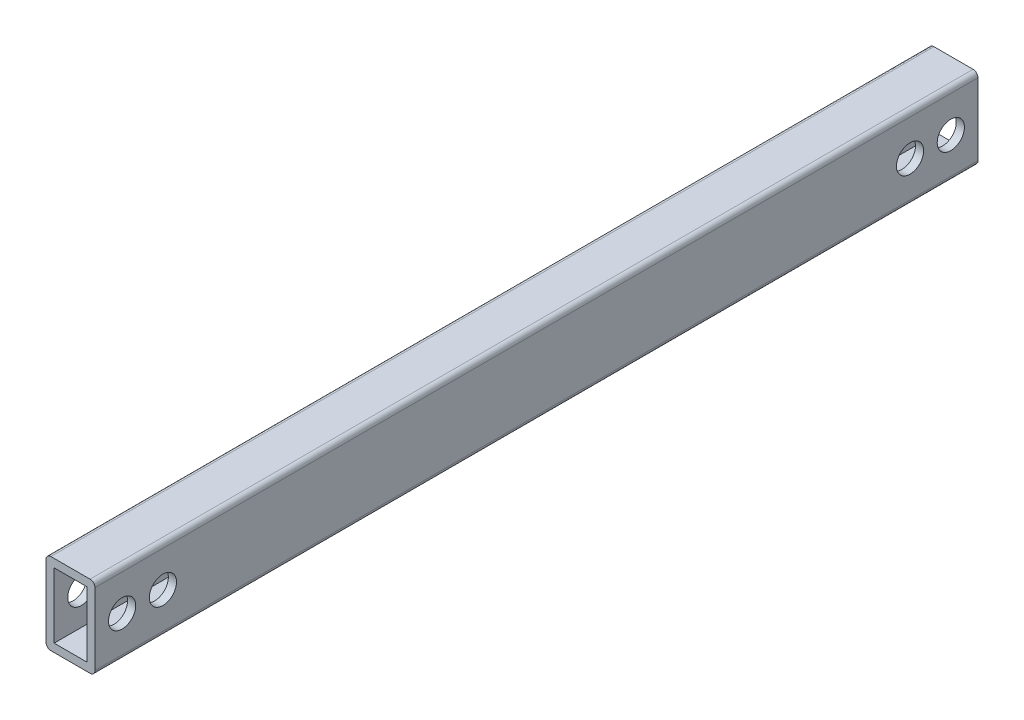
ISO-10303-21;
HEADER;
FILE_DESCRIPTION(('STEP AP214'),'2;1');
FILE_NAME('part.step','',(''),(''),'','','');
FILE_SCHEMA(('AUTOMOTIVE_DESIGN { 1 0 10303 214 1 1 1 1 }'));
ENDSEC;
DATA;
#1=APPLICATION_CONTEXT('core data for automotive mechanical design processes');
#2=APPLICATION_PROTOCOL_DEFINITION('international standard','automotive_design',2000,#1);
#3=PRODUCT_CONTEXT('',#1,'mechanical');
#4=PRODUCT('Part','Part','',(#3));
#5=PRODUCT_RELATED_PRODUCT_CATEGORY('part','',(#4));
#6=PRODUCT_DEFINITION_FORMATION('','',#4);
#7=PRODUCT_DEFINITION_CONTEXT('part definition',#1,'design');
#8=PRODUCT_DEFINITION('design','',#6,#7);
#9=PRODUCT_DEFINITION_SHAPE('','',#8);
#10=(LENGTH_UNIT() NAMED_UNIT(*) SI_UNIT(.MILLI.,.METRE.));
#11=(NAMED_UNIT(*) PLANE_ANGLE_UNIT() SI_UNIT($,.RADIAN.));
#12=(NAMED_UNIT(*) SI_UNIT($,.STERADIAN.) SOLID_ANGLE_UNIT());
#13=UNCERTAINTY_MEASURE_WITH_UNIT(LENGTH_MEASURE(1.E-05),#10,'distance_accuracy_value','');
#14=(GEOMETRIC_REPRESENTATION_CONTEXT(3) GLOBAL_UNCERTAINTY_ASSIGNED_CONTEXT((#13)) GLOBAL_UNIT_ASSIGNED_CONTEXT((#10,
#11,#12)) REPRESENTATION_CONTEXT('',''));
#15=CARTESIAN_POINT('',(0.,0.,0.));
#16=DIRECTION('',(0.,0.,1.));
#17=DIRECTION('',(1.,0.,0.));
#18=AXIS2_PLACEMENT_3D('',#15,#16,#17);
#19=CARTESIAN_POINT('',(0.,0.,324.79860434));
#20=DIRECTION('',(0.,0.,1.));
#21=DIRECTION('',(1.,0.,0.));
#22=AXIS2_PLACEMENT_3D('',#19,#20,#21);
#23=PLANE('',#22);
#24=DIRECTION('',(0.,-1.,0.));
#25=VECTOR('',#24,1.);
#26=CARTESIAN_POINT('',(-9.,-15.,324.79860434));
#27=LINE('',#26,#25);
#28=CARTESIAN_POINT('',(-9.,13.2,324.79860434));
#29=VERTEX_POINT('',#28);
#30=CARTESIAN_POINT('',(-9.,-13.2,324.79860434));
#31=VERTEX_POINT('',#30);
#32=EDGE_CURVE('E170',#29,#31,#27,.T.);
#33=ORIENTED_EDGE('',*,*,#32,.T.);
#34=CARTESIAN_POINT('',(-7.2,-13.2,324.79860434));
#35=DIRECTION('',(0.,0.,1.));
#36=DIRECTION('',(1.,0.,0.));
#37=AXIS2_PLACEMENT_3D('',#34,#35,#36);
#38=CIRCLE('',#37,1.8);
#39=CARTESIAN_POINT('',(-7.2,-15.,324.79860434));
#40=VERTEX_POINT('',#39);
#41=EDGE_CURVE('E229',#31,#40,#38,.T.);
#42=ORIENTED_EDGE('',*,*,#41,.T.);
#43=DIRECTION('',(1.,0.,0.));
#44=VECTOR('',#43,1.);
#45=CARTESIAN_POINT('',(9.,-15.,324.79860434));
#46=LINE('',#45,#44);
#47=CARTESIAN_POINT('',(7.2,-15.,324.79860434));
#48=VERTEX_POINT('',#47);
#49=EDGE_CURVE('E173',#40,#48,#46,.T.);
#50=ORIENTED_EDGE('',*,*,#49,.T.);
#51=CARTESIAN_POINT('',(7.2,-13.2,324.79860434));
#52=DIRECTION('',(0.,0.,1.));
#53=DIRECTION('',(1.,0.,0.));
#54=AXIS2_PLACEMENT_3D('',#51,#52,#53);
#55=CIRCLE('',#54,1.8);
#56=CARTESIAN_POINT('',(9.,-13.2,324.79860434));
#57=VERTEX_POINT('',#56);
#58=EDGE_CURVE('E227',#48,#57,#55,.T.);
#59=ORIENTED_EDGE('',*,*,#58,.T.);
#60=DIRECTION('',(0.,1.,0.));
#61=VECTOR('',#60,1.);
#62=CARTESIAN_POINT('',(9.,-15.,324.79860434));
#63=LINE('',#62,#61);
#64=CARTESIAN_POINT('',(9.,13.2,324.79860434));
#65=VERTEX_POINT('',#64);
#66=EDGE_CURVE('E177',#57,#65,#63,.T.);
#67=ORIENTED_EDGE('',*,*,#66,.T.);
#68=CARTESIAN_POINT('',(7.2,13.2,324.79860434));
#69=DIRECTION('',(0.,0.,1.));
#70=DIRECTION('',(1.,0.,0.));
#71=AXIS2_PLACEMENT_3D('',#68,#69,#70);
#72=CIRCLE('',#71,1.8);
#73=CARTESIAN_POINT('',(7.2,15.,324.79860434));
#74=VERTEX_POINT('',#73);
#75=EDGE_CURVE('E57',#65,#74,#72,.T.);
#76=ORIENTED_EDGE('',*,*,#75,.T.);
#77=DIRECTION('',(-1.,0.,0.));
#78=VECTOR('',#77,1.);
#79=CARTESIAN_POINT('',(9.,15.,324.79860434));
#80=LINE('',#79,#78);
#81=CARTESIAN_POINT('',(-7.2,15.,324.79860434));
#82=VERTEX_POINT('',#81);
#83=EDGE_CURVE('E179',#74,#82,#80,.T.);
#84=ORIENTED_EDGE('',*,*,#83,.T.);
#85=CARTESIAN_POINT('',(-7.2,13.2,324.79860434));
#86=DIRECTION('',(0.,0.,1.));
#87=DIRECTION('',(1.,0.,0.));
#88=AXIS2_PLACEMENT_3D('',#85,#86,#87);
#89=CIRCLE('',#88,1.8);
#90=EDGE_CURVE('E224',#82,#29,#89,.T.);
#91=ORIENTED_EDGE('',*,*,#90,.T.);
#92=EDGE_LOOP('',(#33,#42,#50,#59,#67,#76,#84,#91));
#93=FACE_BOUND('',#92,.T.);
#94=DIRECTION('',(1.,0.,0.));
#95=VECTOR('',#94,1.);
#96=CARTESIAN_POINT('',(6.,-12.,324.79860434));
#97=LINE('',#96,#95);
#98=CARTESIAN_POINT('',(-6.,-12.,324.79860434));
#99=VERTEX_POINT('',#98);
#100=CARTESIAN_POINT('',(6.,-12.,324.79860434));
#101=VERTEX_POINT('',#100);
#102=EDGE_CURVE('E137',#99,#101,#97,.T.);
#103=ORIENTED_EDGE('',*,*,#102,.F.);
#104=DIRECTION('',(0.,-1.,0.));
#105=VECTOR('',#104,1.);
#106=CARTESIAN_POINT('',(-6.,-12.,324.79860434));
#107=LINE('',#106,#105);
#108=CARTESIAN_POINT('',(-6.,12.,324.79860434));
#109=VERTEX_POINT('',#108);
#110=EDGE_CURVE('E127',#109,#99,#107,.T.);
#111=ORIENTED_EDGE('',*,*,#110,.F.);
#112=DIRECTION('',(-1.,0.,0.));
#113=VECTOR('',#112,1.);
#114=CARTESIAN_POINT('',(6.,12.,324.79860434));
#115=LINE('',#114,#113);
#116=CARTESIAN_POINT('',(6.,12.,324.79860434));
#117=VERTEX_POINT('',#116);
#118=EDGE_CURVE('E152',#117,#109,#115,.T.);
#119=ORIENTED_EDGE('',*,*,#118,.F.);
#120=DIRECTION('',(0.,1.,0.));
#121=VECTOR('',#120,1.);
#122=CARTESIAN_POINT('',(6.,-12.,324.79860434));
#123=LINE('',#122,#121);
#124=EDGE_CURVE('E150',#101,#117,#123,.T.);
#125=ORIENTED_EDGE('',*,*,#124,.F.);
#126=EDGE_LOOP('',(#103,#111,#119,#125));
#127=FACE_BOUND('',#126,.T.);
#128=ADVANCED_FACE('F36',(#93,#127),#23,.T.);
#129=CARTESIAN_POINT('',(0.,0.,0.));
#130=DIRECTION('',(0.,0.,1.));
#131=DIRECTION('',(1.,0.,0.));
#132=AXIS2_PLACEMENT_3D('',#129,#130,#131);
#133=PLANE('',#132);
#134=DIRECTION('',(1.,0.,0.));
#135=VECTOR('',#134,1.);
#136=CARTESIAN_POINT('',(9.,-15.,0.));
#137=LINE('',#136,#135);
#138=CARTESIAN_POINT('',(-7.2,-15.,0.));
#139=VERTEX_POINT('',#138);
#140=CARTESIAN_POINT('',(7.2,-15.,0.));
#141=VERTEX_POINT('',#140);
#142=EDGE_CURVE('E184',#139,#141,#137,.T.);
#143=ORIENTED_EDGE('',*,*,#142,.F.);
#144=CARTESIAN_POINT('',(-7.2,-13.2,0.));
#145=DIRECTION('',(0.,0.,1.));
#146=DIRECTION('',(1.,0.,0.));
#147=AXIS2_PLACEMENT_3D('',#144,#145,#146);
#148=CIRCLE('',#147,1.8);
#149=CARTESIAN_POINT('',(-9.,-13.2,0.));
#150=VERTEX_POINT('',#149);
#151=EDGE_CURVE('E217',#139,#150,#148,.F.);
#152=ORIENTED_EDGE('',*,*,#151,.T.);
#153=DIRECTION('',(0.,-1.,0.));
#154=VECTOR('',#153,1.);
#155=CARTESIAN_POINT('',(-9.,-15.,0.));
#156=LINE('',#155,#154);
#157=CARTESIAN_POINT('',(-9.,13.2,0.));
#158=VERTEX_POINT('',#157);
#159=EDGE_CURVE('E145',#158,#150,#156,.T.);
#160=ORIENTED_EDGE('',*,*,#159,.F.);
#161=CARTESIAN_POINT('',(-7.2,13.2,0.));
#162=DIRECTION('',(0.,0.,1.));
#163=DIRECTION('',(1.,0.,0.));
#164=AXIS2_PLACEMENT_3D('',#161,#162,#163);
#165=CIRCLE('',#164,1.8);
#166=CARTESIAN_POINT('',(-7.2,15.,0.));
#167=VERTEX_POINT('',#166);
#168=EDGE_CURVE('E211',#158,#167,#165,.F.);
#169=ORIENTED_EDGE('',*,*,#168,.T.);
#170=DIRECTION('',(-1.,0.,0.));
#171=VECTOR('',#170,1.);
#172=CARTESIAN_POINT('',(9.,15.,0.));
#173=LINE('',#172,#171);
#174=CARTESIAN_POINT('',(7.2,15.,0.));
#175=VERTEX_POINT('',#174);
#176=EDGE_CURVE('E174',#175,#167,#173,.T.);
#177=ORIENTED_EDGE('',*,*,#176,.F.);
#178=CARTESIAN_POINT('',(7.2,13.2,0.));
#179=DIRECTION('',(0.,0.,1.));
#180=DIRECTION('',(1.,0.,0.));
#181=AXIS2_PLACEMENT_3D('',#178,#179,#180);
#182=CIRCLE('',#181,1.8);
#183=CARTESIAN_POINT('',(9.,13.2,0.));
#184=VERTEX_POINT('',#183);
#185=EDGE_CURVE('E213',#175,#184,#182,.F.);
#186=ORIENTED_EDGE('',*,*,#185,.T.);
#187=DIRECTION('',(0.,1.,0.));
#188=VECTOR('',#187,1.);
#189=CARTESIAN_POINT('',(9.,-15.,0.));
#190=LINE('',#189,#188);
#191=CARTESIAN_POINT('',(9.,-13.2,0.));
#192=VERTEX_POINT('',#191);
#193=EDGE_CURVE('E187',#192,#184,#190,.T.);
#194=ORIENTED_EDGE('',*,*,#193,.F.);
#195=CARTESIAN_POINT('',(7.2,-13.2,0.));
#196=DIRECTION('',(0.,0.,1.));
#197=DIRECTION('',(1.,0.,0.));
#198=AXIS2_PLACEMENT_3D('',#195,#196,#197);
#199=CIRCLE('',#198,1.8);
#200=EDGE_CURVE('E215',#192,#141,#199,.F.);
#201=ORIENTED_EDGE('',*,*,#200,.T.);
#202=EDGE_LOOP('',(#143,#152,#160,#169,#177,#186,#194,#201));
#203=FACE_BOUND('',#202,.T.);
#204=DIRECTION('',(0.,-1.,0.));
#205=VECTOR('',#204,1.);
#206=CARTESIAN_POINT('',(-6.,-12.,0.));
#207=LINE('',#206,#205);
#208=CARTESIAN_POINT('',(-6.,12.,0.));
#209=VERTEX_POINT('',#208);
#210=CARTESIAN_POINT('',(-6.,-12.,0.));
#211=VERTEX_POINT('',#210);
#212=EDGE_CURVE('E157',#209,#211,#207,.T.);
#213=ORIENTED_EDGE('',*,*,#212,.T.);
#214=DIRECTION('',(1.,0.,0.));
#215=VECTOR('',#214,1.);
#216=CARTESIAN_POINT('',(6.,-12.,0.));
#217=LINE('',#216,#215);
#218=CARTESIAN_POINT('',(6.,-12.,0.));
#219=VERTEX_POINT('',#218);
#220=EDGE_CURVE('E144',#211,#219,#217,.T.);
#221=ORIENTED_EDGE('',*,*,#220,.T.);
#222=DIRECTION('',(0.,1.,0.));
#223=VECTOR('',#222,1.);
#224=CARTESIAN_POINT('',(6.,-12.,0.));
#225=LINE('',#224,#223);
#226=CARTESIAN_POINT('',(6.,12.,0.));
#227=VERTEX_POINT('',#226);
#228=EDGE_CURVE('E161',#219,#227,#225,.T.);
#229=ORIENTED_EDGE('',*,*,#228,.T.);
#230=DIRECTION('',(-1.,0.,0.));
#231=VECTOR('',#230,1.);
#232=CARTESIAN_POINT('',(6.,12.,0.));
#233=LINE('',#232,#231);
#234=EDGE_CURVE('E138',#227,#209,#233,.T.);
#235=ORIENTED_EDGE('',*,*,#234,.T.);
#236=EDGE_LOOP('',(#213,#221,#229,#235));
#237=FACE_BOUND('',#236,.T.);
#238=ADVANCED_FACE('F245',(#203,#237),#133,.F.);
#239=CARTESIAN_POINT('',(-9.,-15.,324.79860434));
#240=DIRECTION('',(1.,0.,0.));
#241=DIRECTION('',(0.,0.,-1.));
#242=AXIS2_PLACEMENT_3D('',#239,#240,#241);
#243=PLANE('',#242);
#244=CARTESIAN_POINT('',(-9.,0.,314.79860434));
#245=DIRECTION('',(1.,0.,0.));
#246=DIRECTION('',(0.,0.,-1.));
#247=AXIS2_PLACEMENT_3D('',#244,#245,#246);
#248=CIRCLE('',#247,4.99999999999999);
#249=CARTESIAN_POINT('',(-9.,0.,309.79860434));
#250=VERTEX_POINT('',#249);
#251=EDGE_CURVE('E195',#250,#250,#248,.T.);
#252=ORIENTED_EDGE('',*,*,#251,.T.);
#253=EDGE_LOOP('',(#252));
#254=FACE_BOUND('',#253,.T.);
#255=CARTESIAN_POINT('',(-9.,0.,299.79860434));
#256=DIRECTION('',(1.,0.,0.));
#257=DIRECTION('',(0.,0.,-1.));
#258=AXIS2_PLACEMENT_3D('',#255,#256,#257);
#259=CIRCLE('',#258,4.99999999999999);
#260=CARTESIAN_POINT('',(-9.,0.,294.79860434));
#261=VERTEX_POINT('',#260);
#262=EDGE_CURVE('E303',#261,#261,#259,.T.);
#263=ORIENTED_EDGE('',*,*,#262,.T.);
#264=EDGE_LOOP('',(#263));
#265=FACE_BOUND('',#264,.T.);
#266=CARTESIAN_POINT('',(-9.,0.,25.));
#267=DIRECTION('',(1.,0.,0.));
#268=DIRECTION('',(0.,0.,1.));
#269=AXIS2_PLACEMENT_3D('',#266,#267,#268);
#270=CIRCLE('',#269,4.99999999999999);
#271=CARTESIAN_POINT('',(-9.,0.,30.));
#272=VERTEX_POINT('',#271);
#273=EDGE_CURVE('E307',#272,#272,#270,.T.);
#274=ORIENTED_EDGE('',*,*,#273,.T.);
#275=EDGE_LOOP('',(#274));
#276=FACE_BOUND('',#275,.T.);
#277=CARTESIAN_POINT('',(-9.,0.,10.));
#278=DIRECTION('',(1.,0.,0.));
#279=DIRECTION('',(0.,0.,1.));
#280=AXIS2_PLACEMENT_3D('',#277,#278,#279);
#281=CIRCLE('',#280,4.99999999999999);
#282=CARTESIAN_POINT('',(-9.,0.,15.));
#283=VERTEX_POINT('',#282);
#284=EDGE_CURVE('E310',#283,#283,#281,.T.);
#285=ORIENTED_EDGE('',*,*,#284,.T.);
#286=EDGE_LOOP('',(#285));
#287=FACE_BOUND('',#286,.T.);
#288=ORIENTED_EDGE('',*,*,#159,.T.);
#289=DIRECTION('',(0.,0.,-1.));
#290=VECTOR('',#289,1.);
#291=CARTESIAN_POINT('',(-9.,-13.2,324.79860434));
#292=LINE('',#291,#290);
#293=EDGE_CURVE('E222',#150,#31,#292,.F.);
#294=ORIENTED_EDGE('',*,*,#293,.T.);
#295=ORIENTED_EDGE('',*,*,#32,.F.);
#296=DIRECTION('',(0.,0.,-1.));
#297=VECTOR('',#296,1.);
#298=CARTESIAN_POINT('',(-9.,13.2,324.79860434));
#299=LINE('',#298,#297);
#300=EDGE_CURVE('E219',#29,#158,#299,.T.);
#301=ORIENTED_EDGE('',*,*,#300,.T.);
#302=EDGE_LOOP('',(#288,#294,#295,#301));
#303=FACE_BOUND('',#302,.T.);
#304=ADVANCED_FACE('F258',(#254,#265,#276,#287,#303),#243,.F.);
#305=CARTESIAN_POINT('',(9.,-15.,324.79860434));
#306=DIRECTION('',(0.,1.,0.));
#307=DIRECTION('',(0.,0.,1.));
#308=AXIS2_PLACEMENT_3D('',#305,#306,#307);
#309=PLANE('',#308);
#310=ORIENTED_EDGE('',*,*,#49,.F.);
#311=DIRECTION('',(0.,0.,-1.));
#312=VECTOR('',#311,1.);
#313=CARTESIAN_POINT('',(-7.2,-15.,324.79860434));
#314=LINE('',#313,#312);
#315=EDGE_CURVE('E208',#40,#139,#314,.T.);
#316=ORIENTED_EDGE('',*,*,#315,.T.);
#317=ORIENTED_EDGE('',*,*,#142,.T.);
#318=DIRECTION('',(0.,0.,-1.));
#319=VECTOR('',#318,1.);
#320=CARTESIAN_POINT('',(7.2,-15.,324.79860434));
#321=LINE('',#320,#319);
#322=EDGE_CURVE('E181',#141,#48,#321,.F.);
#323=ORIENTED_EDGE('',*,*,#322,.T.);
#324=EDGE_LOOP('',(#310,#316,#317,#323));
#325=FACE_BOUND('',#324,.T.);
#326=ADVANCED_FACE('F266',(#325),#309,.F.);
#327=CARTESIAN_POINT('',(9.,-15.,324.79860434));
#328=DIRECTION('',(-1.,0.,0.));
#329=DIRECTION('',(0.,0.,1.));
#330=AXIS2_PLACEMENT_3D('',#327,#328,#329);
#331=PLANE('',#330);
#332=CARTESIAN_POINT('',(9.,0.,314.79860434));
#333=DIRECTION('',(1.,0.,0.));
#334=DIRECTION('',(0.,0.,-1.));
#335=AXIS2_PLACEMENT_3D('',#332,#333,#334);
#336=CIRCLE('',#335,4.99999999999999);
#337=CARTESIAN_POINT('',(9.,0.,309.79860434));
#338=VERTEX_POINT('',#337);
#339=EDGE_CURVE('E394',#338,#338,#336,.T.);
#340=ORIENTED_EDGE('',*,*,#339,.F.);
#341=EDGE_LOOP('',(#340));
#342=FACE_BOUND('',#341,.T.);
#343=CARTESIAN_POINT('',(9.,0.,299.79860434));
#344=DIRECTION('',(1.,0.,0.));
#345=DIRECTION('',(0.,0.,-1.));
#346=AXIS2_PLACEMENT_3D('',#343,#344,#345);
#347=CIRCLE('',#346,4.99999999999999);
#348=CARTESIAN_POINT('',(9.,0.,294.79860434));
#349=VERTEX_POINT('',#348);
#350=EDGE_CURVE('E389',#349,#349,#347,.T.);
#351=ORIENTED_EDGE('',*,*,#350,.F.);
#352=EDGE_LOOP('',(#351));
#353=FACE_BOUND('',#352,.T.);
#354=CARTESIAN_POINT('',(9.,0.,25.));
#355=DIRECTION('',(1.,0.,0.));
#356=DIRECTION('',(0.,0.,1.));
#357=AXIS2_PLACEMENT_3D('',#354,#355,#356);
#358=CIRCLE('',#357,4.99999999999999);
#359=CARTESIAN_POINT('',(9.,0.,30.));
#360=VERTEX_POINT('',#359);
#361=EDGE_CURVE('E386',#360,#360,#358,.T.);
#362=ORIENTED_EDGE('',*,*,#361,.F.);
#363=EDGE_LOOP('',(#362));
#364=FACE_BOUND('',#363,.T.);
#365=CARTESIAN_POINT('',(9.,0.,10.));
#366=DIRECTION('',(1.,0.,0.));
#367=DIRECTION('',(0.,0.,1.));
#368=AXIS2_PLACEMENT_3D('',#365,#366,#367);
#369=CIRCLE('',#368,4.99999999999999);
#370=CARTESIAN_POINT('',(9.,0.,15.));
#371=VERTEX_POINT('',#370);
#372=EDGE_CURVE('E312',#371,#371,#369,.T.);
#373=ORIENTED_EDGE('',*,*,#372,.F.);
#374=EDGE_LOOP('',(#373));
#375=FACE_BOUND('',#374,.T.);
#376=ORIENTED_EDGE('',*,*,#66,.F.);
#377=DIRECTION('',(0.,0.,-1.));
#378=VECTOR('',#377,1.);
#379=CARTESIAN_POINT('',(9.,-13.2,324.79860434));
#380=LINE('',#379,#378);
#381=EDGE_CURVE('E233',#57,#192,#380,.T.);
#382=ORIENTED_EDGE('',*,*,#381,.T.);
#383=ORIENTED_EDGE('',*,*,#193,.T.);
#384=DIRECTION('',(0.,0.,-1.));
#385=VECTOR('',#384,1.);
#386=CARTESIAN_POINT('',(9.,13.2,324.79860434));
#387=LINE('',#386,#385);
#388=EDGE_CURVE('E231',#184,#65,#387,.F.);
#389=ORIENTED_EDGE('',*,*,#388,.T.);
#390=EDGE_LOOP('',(#376,#382,#383,#389));
#391=FACE_BOUND('',#390,.T.);
#392=ADVANCED_FACE('F239',(#342,#353,#364,#375,#391),#331,.F.);
#393=CARTESIAN_POINT('',(9.,15.,324.79860434));
#394=DIRECTION('',(0.,-1.,0.));
#395=DIRECTION('',(0.,0.,-1.));
#396=AXIS2_PLACEMENT_3D('',#393,#394,#395);
#397=PLANE('',#396);
#398=ORIENTED_EDGE('',*,*,#83,.F.);
#399=DIRECTION('',(0.,0.,-1.));
#400=VECTOR('',#399,1.);
#401=CARTESIAN_POINT('',(7.2,15.,324.79860434));
#402=LINE('',#401,#400);
#403=EDGE_CURVE('E11',#74,#175,#402,.T.);
#404=ORIENTED_EDGE('',*,*,#403,.T.);
#405=ORIENTED_EDGE('',*,*,#176,.T.);
#406=DIRECTION('',(0.,0.,-1.));
#407=VECTOR('',#406,1.);
#408=CARTESIAN_POINT('',(-7.2,15.,324.79860434));
#409=LINE('',#408,#407);
#410=EDGE_CURVE('E44',#167,#82,#409,.F.);
#411=ORIENTED_EDGE('',*,*,#410,.T.);
#412=EDGE_LOOP('',(#398,#404,#405,#411));
#413=FACE_BOUND('',#412,.T.);
#414=ADVANCED_FACE('F251',(#413),#397,.F.);
#415=CARTESIAN_POINT('',(-6.,-12.,324.79860434));
#416=DIRECTION('',(1.,0.,0.));
#417=DIRECTION('',(0.,0.,-1.));
#418=AXIS2_PLACEMENT_3D('',#415,#416,#417);
#419=PLANE('',#418);
#420=CARTESIAN_POINT('',(-6.,0.,314.79860434));
#421=DIRECTION('',(1.,0.,0.));
#422=DIRECTION('',(0.,0.,-1.));
#423=AXIS2_PLACEMENT_3D('',#420,#421,#422);
#424=CIRCLE('',#423,4.99999999999999);
#425=CARTESIAN_POINT('',(-6.,0.,309.79860434));
#426=VERTEX_POINT('',#425);
#427=EDGE_CURVE('E159',#426,#426,#424,.T.);
#428=ORIENTED_EDGE('',*,*,#427,.F.);
#429=EDGE_LOOP('',(#428));
#430=FACE_BOUND('',#429,.T.);
#431=CARTESIAN_POINT('',(-6.,0.,299.79860434));
#432=DIRECTION('',(1.,0.,0.));
#433=DIRECTION('',(0.,0.,-1.));
#434=AXIS2_PLACEMENT_3D('',#431,#432,#433);
#435=CIRCLE('',#434,4.99999999999999);
#436=CARTESIAN_POINT('',(-6.,0.,294.79860434));
#437=VERTEX_POINT('',#436);
#438=EDGE_CURVE('E203',#437,#437,#435,.T.);
#439=ORIENTED_EDGE('',*,*,#438,.F.);
#440=EDGE_LOOP('',(#439));
#441=FACE_BOUND('',#440,.T.);
#442=CARTESIAN_POINT('',(-6.,0.,25.));
#443=DIRECTION('',(1.,0.,0.));
#444=DIRECTION('',(0.,0.,-1.));
#445=AXIS2_PLACEMENT_3D('',#442,#443,#444);
#446=CIRCLE('',#445,4.99999999999999);
#447=CARTESIAN_POINT('',(-6.,0.,20.));
#448=VERTEX_POINT('',#447);
#449=EDGE_CURVE('E199',#448,#448,#446,.T.);
#450=ORIENTED_EDGE('',*,*,#449,.F.);
#451=EDGE_LOOP('',(#450));
#452=FACE_BOUND('',#451,.T.);
#453=CARTESIAN_POINT('',(-6.,0.,10.));
#454=DIRECTION('',(1.,0.,0.));
#455=DIRECTION('',(0.,0.,-1.));
#456=AXIS2_PLACEMENT_3D('',#453,#454,#455);
#457=CIRCLE('',#456,4.99999999999999);
#458=CARTESIAN_POINT('',(-6.,0.,5.00000000000002));
#459=VERTEX_POINT('',#458);
#460=EDGE_CURVE('E194',#459,#459,#457,.T.);
#461=ORIENTED_EDGE('',*,*,#460,.F.);
#462=EDGE_LOOP('',(#461));
#463=FACE_BOUND('',#462,.T.);
#464=ORIENTED_EDGE('',*,*,#212,.F.);
#465=DIRECTION('',(0.,0.,-1.));
#466=VECTOR('',#465,1.);
#467=CARTESIAN_POINT('',(-6.,12.,324.79860434));
#468=LINE('',#467,#466);
#469=EDGE_CURVE('E133',#109,#209,#468,.T.);
#470=ORIENTED_EDGE('',*,*,#469,.F.);
#471=ORIENTED_EDGE('',*,*,#110,.T.);
#472=DIRECTION('',(0.,0.,-1.));
#473=VECTOR('',#472,1.);
#474=CARTESIAN_POINT('',(-6.,-12.,324.79860434));
#475=LINE('',#474,#473);
#476=EDGE_CURVE('E130',#99,#211,#475,.T.);
#477=ORIENTED_EDGE('',*,*,#476,.T.);
#478=EDGE_LOOP('',(#464,#470,#471,#477));
#479=FACE_BOUND('',#478,.T.);
#480=ADVANCED_FACE('F129',(#430,#441,#452,#463,#479),#419,.T.);
#481=CARTESIAN_POINT('',(6.,-12.,324.79860434));
#482=DIRECTION('',(0.,1.,0.));
#483=DIRECTION('',(0.,0.,1.));
#484=AXIS2_PLACEMENT_3D('',#481,#482,#483);
#485=PLANE('',#484);
#486=ORIENTED_EDGE('',*,*,#220,.F.);
#487=ORIENTED_EDGE('',*,*,#476,.F.);
#488=ORIENTED_EDGE('',*,*,#102,.T.);
#489=DIRECTION('',(0.,0.,-1.));
#490=VECTOR('',#489,1.);
#491=CARTESIAN_POINT('',(6.,-12.,324.79860434));
#492=LINE('',#491,#490);
#493=EDGE_CURVE('E146',#101,#219,#492,.T.);
#494=ORIENTED_EDGE('',*,*,#493,.T.);
#495=EDGE_LOOP('',(#486,#487,#488,#494));
#496=FACE_BOUND('',#495,.T.);
#497=ADVANCED_FACE('F141',(#496),#485,.T.);
#498=CARTESIAN_POINT('',(6.,-12.,324.79860434));
#499=DIRECTION('',(-1.,0.,0.));
#500=DIRECTION('',(0.,0.,1.));
#501=AXIS2_PLACEMENT_3D('',#498,#499,#500);
#502=PLANE('',#501);
#503=CARTESIAN_POINT('',(6.,0.,314.79860434));
#504=DIRECTION('',(-1.,0.,0.));
#505=DIRECTION('',(0.,0.,1.));
#506=AXIS2_PLACEMENT_3D('',#503,#504,#505);
#507=CIRCLE('',#506,4.99999999999999);
#508=CARTESIAN_POINT('',(6.,0.,319.79860434));
#509=VERTEX_POINT('',#508);
#510=EDGE_CURVE('E204',#509,#509,#507,.T.);
#511=ORIENTED_EDGE('',*,*,#510,.F.);
#512=EDGE_LOOP('',(#511));
#513=FACE_BOUND('',#512,.T.);
#514=CARTESIAN_POINT('',(6.,0.,299.79860434));
#515=DIRECTION('',(-1.,0.,0.));
#516=DIRECTION('',(0.,0.,1.));
#517=AXIS2_PLACEMENT_3D('',#514,#515,#516);
#518=CIRCLE('',#517,4.99999999999999);
#519=CARTESIAN_POINT('',(6.,0.,304.79860434));
#520=VERTEX_POINT('',#519);
#521=EDGE_CURVE('E200',#520,#520,#518,.T.);
#522=ORIENTED_EDGE('',*,*,#521,.F.);
#523=EDGE_LOOP('',(#522));
#524=FACE_BOUND('',#523,.T.);
#525=CARTESIAN_POINT('',(6.,0.,25.));
#526=DIRECTION('',(-1.,0.,0.));
#527=DIRECTION('',(0.,0.,1.));
#528=AXIS2_PLACEMENT_3D('',#525,#526,#527);
#529=CIRCLE('',#528,4.99999999999999);
#530=CARTESIAN_POINT('',(6.,0.,30.));
#531=VERTEX_POINT('',#530);
#532=EDGE_CURVE('E196',#531,#531,#529,.T.);
#533=ORIENTED_EDGE('',*,*,#532,.F.);
#534=EDGE_LOOP('',(#533));
#535=FACE_BOUND('',#534,.T.);
#536=CARTESIAN_POINT('',(6.,0.,10.));
#537=DIRECTION('',(-1.,0.,0.));
#538=DIRECTION('',(0.,0.,1.));
#539=AXIS2_PLACEMENT_3D('',#536,#537,#538);
#540=CIRCLE('',#539,4.99999999999999);
#541=CARTESIAN_POINT('',(6.,0.,15.));
#542=VERTEX_POINT('',#541);
#543=EDGE_CURVE('E191',#542,#542,#540,.T.);
#544=ORIENTED_EDGE('',*,*,#543,.F.);
#545=EDGE_LOOP('',(#544));
#546=FACE_BOUND('',#545,.T.);
#547=ORIENTED_EDGE('',*,*,#228,.F.);
#548=ORIENTED_EDGE('',*,*,#493,.F.);
#549=ORIENTED_EDGE('',*,*,#124,.T.);
#550=DIRECTION('',(0.,0.,-1.));
#551=VECTOR('',#550,1.);
#552=CARTESIAN_POINT('',(6.,12.,324.79860434));
#553=LINE('',#552,#551);
#554=EDGE_CURVE('E167',#117,#227,#553,.T.);
#555=ORIENTED_EDGE('',*,*,#554,.T.);
#556=EDGE_LOOP('',(#547,#548,#549,#555));
#557=FACE_BOUND('',#556,.T.);
#558=ADVANCED_FACE('F362',(#513,#524,#535,#546,#557),#502,.T.);
#559=CARTESIAN_POINT('',(6.,12.,324.79860434));
#560=DIRECTION('',(0.,-1.,0.));
#561=DIRECTION('',(0.,0.,-1.));
#562=AXIS2_PLACEMENT_3D('',#559,#560,#561);
#563=PLANE('',#562);
#564=ORIENTED_EDGE('',*,*,#234,.F.);
#565=ORIENTED_EDGE('',*,*,#554,.F.);
#566=ORIENTED_EDGE('',*,*,#118,.T.);
#567=ORIENTED_EDGE('',*,*,#469,.T.);
#568=EDGE_LOOP('',(#564,#565,#566,#567));
#569=FACE_BOUND('',#568,.T.);
#570=ADVANCED_FACE('F355',(#569),#563,.T.);
#571=CARTESIAN_POINT('',(-9.,0.,10.));
#572=DIRECTION('',(1.,0.,0.));
#573=DIRECTION('',(0.,0.,-1.));
#574=AXIS2_PLACEMENT_3D('',#571,#572,#573);
#575=CYLINDRICAL_SURFACE('',#574,4.99999999999999);
#576=ORIENTED_EDGE('',*,*,#543,.T.);
#577=EDGE_LOOP('',(#576));
#578=FACE_BOUND('',#577,.T.);
#579=ORIENTED_EDGE('',*,*,#372,.T.);
#580=EDGE_LOOP('',(#579));
#581=FACE_BOUND('',#580,.T.);
#582=ADVANCED_FACE('F341',(#578,#581),#575,.F.);
#583=CARTESIAN_POINT('',(-9.,0.,25.));
#584=DIRECTION('',(1.,0.,0.));
#585=DIRECTION('',(0.,0.,-1.));
#586=AXIS2_PLACEMENT_3D('',#583,#584,#585);
#587=CYLINDRICAL_SURFACE('',#586,4.99999999999999);
#588=ORIENTED_EDGE('',*,*,#532,.T.);
#589=EDGE_LOOP('',(#588));
#590=FACE_BOUND('',#589,.T.);
#591=ORIENTED_EDGE('',*,*,#361,.T.);
#592=EDGE_LOOP('',(#591));
#593=FACE_BOUND('',#592,.T.);
#594=ADVANCED_FACE('F349',(#590,#593),#587,.F.);
#595=CARTESIAN_POINT('',(-9.,0.,299.79860434));
#596=DIRECTION('',(1.,0.,0.));
#597=DIRECTION('',(0.,0.,-1.));
#598=AXIS2_PLACEMENT_3D('',#595,#596,#597);
#599=CYLINDRICAL_SURFACE('',#598,4.99999999999999);
#600=ORIENTED_EDGE('',*,*,#521,.T.);
#601=EDGE_LOOP('',(#600));
#602=FACE_BOUND('',#601,.T.);
#603=ORIENTED_EDGE('',*,*,#350,.T.);
#604=EDGE_LOOP('',(#603));
#605=FACE_BOUND('',#604,.T.);
#606=ADVANCED_FACE('F350',(#602,#605),#599,.F.);
#607=CARTESIAN_POINT('',(-9.,0.,314.79860434));
#608=DIRECTION('',(1.,0.,0.));
#609=DIRECTION('',(0.,0.,-1.));
#610=AXIS2_PLACEMENT_3D('',#607,#608,#609);
#611=CYLINDRICAL_SURFACE('',#610,4.99999999999999);
#612=ORIENTED_EDGE('',*,*,#510,.T.);
#613=EDGE_LOOP('',(#612));
#614=FACE_BOUND('',#613,.T.);
#615=ORIENTED_EDGE('',*,*,#339,.T.);
#616=EDGE_LOOP('',(#615));
#617=FACE_BOUND('',#616,.T.);
#618=ADVANCED_FACE('F339',(#614,#617),#611,.F.);
#619=ORIENTED_EDGE('',*,*,#460,.T.);
#620=EDGE_LOOP('',(#619));
#621=FACE_BOUND('',#620,.T.);
#622=ORIENTED_EDGE('',*,*,#284,.F.);
#623=EDGE_LOOP('',(#622));
#624=FACE_BOUND('',#623,.T.);
#625=ADVANCED_FACE('F336',(#621,#624),#575,.F.);
#626=ORIENTED_EDGE('',*,*,#449,.T.);
#627=EDGE_LOOP('',(#626));
#628=FACE_BOUND('',#627,.T.);
#629=ORIENTED_EDGE('',*,*,#273,.F.);
#630=EDGE_LOOP('',(#629));
#631=FACE_BOUND('',#630,.T.);
#632=ADVANCED_FACE('F338',(#628,#631),#587,.F.);
#633=ORIENTED_EDGE('',*,*,#438,.T.);
#634=EDGE_LOOP('',(#633));
#635=FACE_BOUND('',#634,.T.);
#636=ORIENTED_EDGE('',*,*,#262,.F.);
#637=EDGE_LOOP('',(#636));
#638=FACE_BOUND('',#637,.T.);
#639=ADVANCED_FACE('F346',(#635,#638),#599,.F.);
#640=ORIENTED_EDGE('',*,*,#427,.T.);
#641=EDGE_LOOP('',(#640));
#642=FACE_BOUND('',#641,.T.);
#643=ORIENTED_EDGE('',*,*,#251,.F.);
#644=EDGE_LOOP('',(#643));
#645=FACE_BOUND('',#644,.T.);
#646=ADVANCED_FACE('F275',(#642,#645),#611,.F.);
#647=CARTESIAN_POINT('',(-7.2,-13.2,324.79860434));
#648=DIRECTION('',(0.,0.,-1.));
#649=DIRECTION('',(-1.,0.,0.));
#650=AXIS2_PLACEMENT_3D('',#647,#648,#649);
#651=CYLINDRICAL_SURFACE('',#650,1.8);
#652=ORIENTED_EDGE('',*,*,#41,.F.);
#653=ORIENTED_EDGE('',*,*,#293,.F.);
#654=ORIENTED_EDGE('',*,*,#151,.F.);
#655=ORIENTED_EDGE('',*,*,#315,.F.);
#656=EDGE_LOOP('',(#652,#653,#654,#655));
#657=FACE_BOUND('',#656,.T.);
#658=ADVANCED_FACE('F263',(#657),#651,.T.);
#659=CARTESIAN_POINT('',(7.2,-13.2,324.79860434));
#660=DIRECTION('',(0.,0.,-1.));
#661=DIRECTION('',(-1.,0.,0.));
#662=AXIS2_PLACEMENT_3D('',#659,#660,#661);
#663=CYLINDRICAL_SURFACE('',#662,1.8);
#664=ORIENTED_EDGE('',*,*,#58,.F.);
#665=ORIENTED_EDGE('',*,*,#322,.F.);
#666=ORIENTED_EDGE('',*,*,#200,.F.);
#667=ORIENTED_EDGE('',*,*,#381,.F.);
#668=EDGE_LOOP('',(#664,#665,#666,#667));
#669=FACE_BOUND('',#668,.T.);
#670=ADVANCED_FACE('F268',(#669),#663,.T.);
#671=CARTESIAN_POINT('',(7.2,13.2,324.79860434));
#672=DIRECTION('',(0.,0.,-1.));
#673=DIRECTION('',(-1.,0.,0.));
#674=AXIS2_PLACEMENT_3D('',#671,#672,#673);
#675=CYLINDRICAL_SURFACE('',#674,1.8);
#676=ORIENTED_EDGE('',*,*,#75,.F.);
#677=ORIENTED_EDGE('',*,*,#388,.F.);
#678=ORIENTED_EDGE('',*,*,#185,.F.);
#679=ORIENTED_EDGE('',*,*,#403,.F.);
#680=EDGE_LOOP('',(#676,#677,#678,#679));
#681=FACE_BOUND('',#680,.T.);
#682=ADVANCED_FACE('F250',(#681),#675,.T.);
#683=CARTESIAN_POINT('',(-7.2,13.2,324.79860434));
#684=DIRECTION('',(0.,0.,-1.));
#685=DIRECTION('',(-1.,0.,0.));
#686=AXIS2_PLACEMENT_3D('',#683,#684,#685);
#687=CYLINDRICAL_SURFACE('',#686,1.8);
#688=ORIENTED_EDGE('',*,*,#90,.F.);
#689=ORIENTED_EDGE('',*,*,#410,.F.);
#690=ORIENTED_EDGE('',*,*,#168,.F.);
#691=ORIENTED_EDGE('',*,*,#300,.F.);
#692=EDGE_LOOP('',(#688,#689,#690,#691));
#693=FACE_BOUND('',#692,.T.);
#694=ADVANCED_FACE('F38',(#693),#687,.T.);
#695=CLOSED_SHELL('',(#128,#238,#304,#326,#392,#414,#480,#497,#558,#570,#582,#594,#606,#618,
#625,#632,#639,#646,#658,#670,#682,#694));
#696=MANIFOLD_SOLID_BREP('B2',#695);
#697=ADVANCED_BREP_SHAPE_REPRESENTATION('',(#18,#696),#14);
#698=SHAPE_DEFINITION_REPRESENTATION(#9,#697);
ENDSEC;
END-ISO-10303-21;
